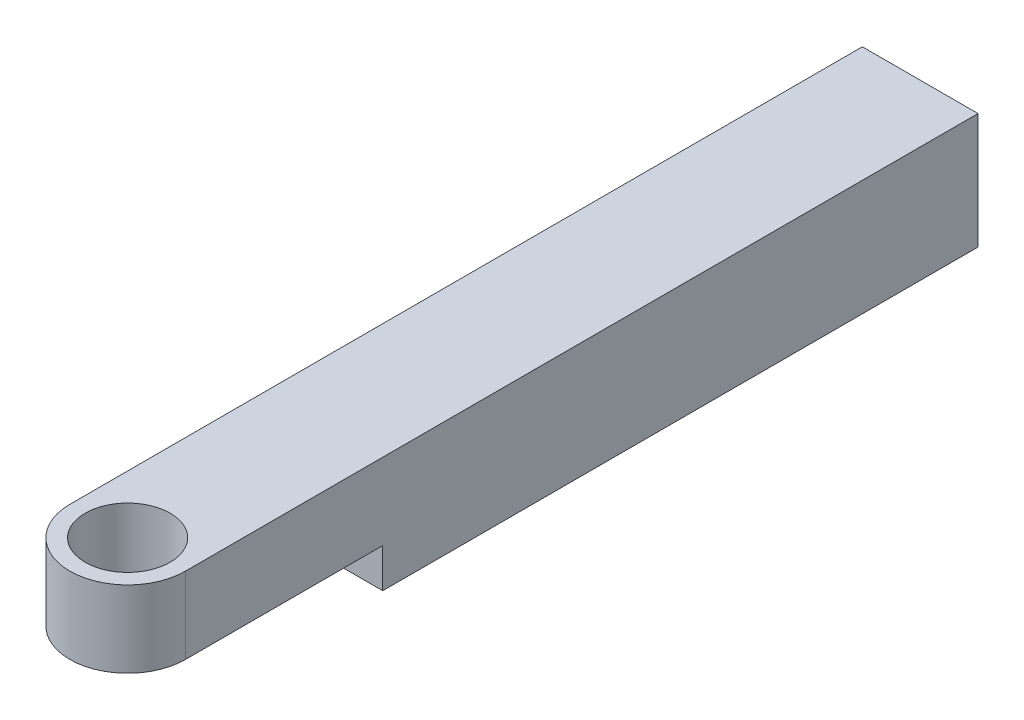
ISO-10303-21;
HEADER;
FILE_DESCRIPTION(('STEP AP214'),'2;1');
FILE_NAME('part.step','',(''),(''),'','','');
FILE_SCHEMA(('AUTOMOTIVE_DESIGN { 1 0 10303 214 1 1 1 1 }'));
ENDSEC;
DATA;
#1=APPLICATION_CONTEXT('core data for automotive mechanical design processes');
#2=APPLICATION_PROTOCOL_DEFINITION('international standard','automotive_design',2000,#1);
#3=PRODUCT_CONTEXT('',#1,'mechanical');
#4=PRODUCT('Part','Part','',(#3));
#5=PRODUCT_RELATED_PRODUCT_CATEGORY('part','',(#4));
#6=PRODUCT_DEFINITION_FORMATION('','',#4);
#7=PRODUCT_DEFINITION_CONTEXT('part definition',#1,'design');
#8=PRODUCT_DEFINITION('design','',#6,#7);
#9=PRODUCT_DEFINITION_SHAPE('','',#8);
#10=(LENGTH_UNIT() NAMED_UNIT(*) SI_UNIT(.MILLI.,.METRE.));
#11=(NAMED_UNIT(*) PLANE_ANGLE_UNIT() SI_UNIT($,.RADIAN.));
#12=(NAMED_UNIT(*) SI_UNIT($,.STERADIAN.) SOLID_ANGLE_UNIT());
#13=UNCERTAINTY_MEASURE_WITH_UNIT(LENGTH_MEASURE(1.E-05),#10,'distance_accuracy_value','');
#14=(GEOMETRIC_REPRESENTATION_CONTEXT(3) GLOBAL_UNCERTAINTY_ASSIGNED_CONTEXT((#13)) GLOBAL_UNIT_ASSIGNED_CONTEXT((#10,
#11,#12)) REPRESENTATION_CONTEXT('',''));
#15=CARTESIAN_POINT('',(0.,0.,0.));
#16=DIRECTION('',(0.,0.,1.));
#17=DIRECTION('',(1.,0.,0.));
#18=AXIS2_PLACEMENT_3D('',#15,#16,#17);
#19=CARTESIAN_POINT('',(-3.4,2.3,46.6));
#20=DIRECTION('',(0.,-1.,0.));
#21=DIRECTION('',(0.,0.,-1.));
#22=AXIS2_PLACEMENT_3D('',#19,#20,#21);
#23=CYLINDRICAL_SURFACE('',#22,3.4);
#24=DIRECTION('',(0.,1.,0.));
#25=VECTOR('',#24,1.);
#26=CARTESIAN_POINT('',(-6.8,2.3,46.6));
#27=LINE('',#26,#25);
#28=CARTESIAN_POINT('',(-6.8,2.3,46.6));
#29=VERTEX_POINT('',#28);
#30=CARTESIAN_POINT('',(-6.8,6.8,46.6));
#31=VERTEX_POINT('',#30);
#32=EDGE_CURVE('E245',#29,#31,#27,.T.);
#33=ORIENTED_EDGE('',*,*,#32,.F.);
#34=CARTESIAN_POINT('',(-3.4,2.3,46.6));
#35=DIRECTION('',(0.,1.,0.));
#36=DIRECTION('',(-1.,0.,0.));
#37=AXIS2_PLACEMENT_3D('',#34,#35,#36);
#38=CIRCLE('',#37,3.4);
#39=CARTESIAN_POINT('',(0.,2.3,46.6));
#40=VERTEX_POINT('',#39);
#41=EDGE_CURVE('E44',#40,#29,#38,.F.);
#42=ORIENTED_EDGE('',*,*,#41,.F.);
#43=DIRECTION('',(0.,1.,0.));
#44=VECTOR('',#43,1.);
#45=CARTESIAN_POINT('',(0.,2.3,46.6));
#46=LINE('',#45,#44);
#47=CARTESIAN_POINT('',(0.,6.8,46.6));
#48=VERTEX_POINT('',#47);
#49=EDGE_CURVE('E157',#48,#40,#46,.F.);
#50=ORIENTED_EDGE('',*,*,#49,.F.);
#51=CARTESIAN_POINT('',(-3.4,6.8,46.6));
#52=DIRECTION('',(0.,-1.,0.));
#53=DIRECTION('',(1.,0.,0.));
#54=AXIS2_PLACEMENT_3D('',#51,#52,#53);
#55=CIRCLE('',#54,3.4);
#56=EDGE_CURVE('E11',#31,#48,#55,.F.);
#57=ORIENTED_EDGE('',*,*,#56,.F.);
#58=EDGE_LOOP('',(#33,#42,#50,#57));
#59=FACE_BOUND('',#58,.T.);
#60=ADVANCED_FACE('F36',(#59),#23,.T.);
#61=CARTESIAN_POINT('',(0.,0.,50.));
#62=DIRECTION('',(0.,1.,0.));
#63=DIRECTION('',(-1.,0.,0.));
#64=AXIS2_PLACEMENT_3D('',#61,#62,#63);
#65=PLANE('',#64);
#66=DIRECTION('',(1.,0.,0.));
#67=VECTOR('',#66,1.);
#68=CARTESIAN_POINT('',(0.,0.,35.));
#69=LINE('',#68,#67);
#70=CARTESIAN_POINT('',(-6.8,0.,35.));
#71=VERTEX_POINT('',#70);
#72=CARTESIAN_POINT('',(0.,0.,35.));
#73=VERTEX_POINT('',#72);
#74=EDGE_CURVE('E150',#71,#73,#69,.T.);
#75=ORIENTED_EDGE('',*,*,#74,.F.);
#76=DIRECTION('',(0.,0.,-1.));
#77=VECTOR('',#76,1.);
#78=CARTESIAN_POINT('',(-6.8,0.,50.));
#79=LINE('',#78,#77);
#80=CARTESIAN_POINT('',(-6.8,0.,0.));
#81=VERTEX_POINT('',#80);
#82=EDGE_CURVE('E237',#71,#81,#79,.T.);
#83=ORIENTED_EDGE('',*,*,#82,.T.);
#84=DIRECTION('',(1.,0.,0.));
#85=VECTOR('',#84,1.);
#86=CARTESIAN_POINT('',(0.,0.,0.));
#87=LINE('',#86,#85);
#88=CARTESIAN_POINT('',(0.,0.,0.));
#89=VERTEX_POINT('',#88);
#90=EDGE_CURVE('E232',#81,#89,#87,.T.);
#91=ORIENTED_EDGE('',*,*,#90,.T.);
#92=DIRECTION('',(0.,0.,-1.));
#93=VECTOR('',#92,1.);
#94=CARTESIAN_POINT('',(0.,0.,50.));
#95=LINE('',#94,#93);
#96=EDGE_CURVE('E235',#73,#89,#95,.T.);
#97=ORIENTED_EDGE('',*,*,#96,.F.);
#98=EDGE_LOOP('',(#75,#83,#91,#97));
#99=FACE_BOUND('',#98,.T.);
#100=ADVANCED_FACE('F277',(#99),#65,.F.);
#101=CARTESIAN_POINT('',(-3.4,3.4,50.));
#102=DIRECTION('',(0.,0.,-1.));
#103=DIRECTION('',(-1.,0.,0.));
#104=AXIS2_PLACEMENT_3D('',#101,#102,#103);
#105=CYLINDRICAL_SURFACE('',#104,1.75);
#106=DIRECTION('',(0.,0.,-1.));
#107=VECTOR('',#106,1.);
#108=CARTESIAN_POINT('',(-2.03893424111838,2.3,50.));
#109=LINE('',#108,#107);
#110=CARTESIAN_POINT('',(-2.03893424111838,2.3,43.));
#111=VERTEX_POINT('',#110);
#112=CARTESIAN_POINT('',(-2.03893424111838,2.3,35.));
#113=VERTEX_POINT('',#112);
#114=EDGE_CURVE('E140',#111,#113,#109,.T.);
#115=ORIENTED_EDGE('',*,*,#114,.F.);
#116=CARTESIAN_POINT('',(-3.4,3.4,43.));
#117=DIRECTION('',(0.,0.,-1.));
#118=DIRECTION('',(-1.,0.,0.));
#119=AXIS2_PLACEMENT_3D('',#116,#117,#118);
#120=CIRCLE('',#119,1.75);
#121=CARTESIAN_POINT('',(-4.76106575888162,2.3,43.));
#122=VERTEX_POINT('',#121);
#123=EDGE_CURVE('E170',#122,#111,#120,.T.);
#124=ORIENTED_EDGE('',*,*,#123,.F.);
#125=DIRECTION('',(0.,0.,-1.));
#126=VECTOR('',#125,1.);
#127=CARTESIAN_POINT('',(-4.76106575888162,2.3,50.));
#128=LINE('',#127,#126);
#129=CARTESIAN_POINT('',(-4.76106575888162,2.3,35.));
#130=VERTEX_POINT('',#129);
#131=EDGE_CURVE('E161',#130,#122,#128,.F.);
#132=ORIENTED_EDGE('',*,*,#131,.F.);
#133=CARTESIAN_POINT('',(-3.4,3.4,35.));
#134=DIRECTION('',(0.,0.,1.));
#135=DIRECTION('',(1.,0.,0.));
#136=AXIS2_PLACEMENT_3D('',#133,#134,#135);
#137=CIRCLE('',#136,1.75);
#138=EDGE_CURVE('E167',#130,#113,#137,.T.);
#139=ORIENTED_EDGE('',*,*,#138,.T.);
#140=EDGE_LOOP('',(#115,#124,#132,#139));
#141=FACE_BOUND('',#140,.T.);
#142=CARTESIAN_POINT('',(-3.4,3.4,20.));
#143=DIRECTION('',(0.,0.,-1.));
#144=DIRECTION('',(-1.,0.,0.));
#145=AXIS2_PLACEMENT_3D('',#142,#143,#144);
#146=CIRCLE('',#145,1.75);
#147=CARTESIAN_POINT('',(-5.15,3.4,20.));
#148=VERTEX_POINT('',#147);
#149=EDGE_CURVE('E212',#148,#148,#146,.T.);
#150=ORIENTED_EDGE('',*,*,#149,.T.);
#151=EDGE_LOOP('',(#150));
#152=FACE_BOUND('',#151,.T.);
#153=ADVANCED_FACE('F281',(#141,#152),#105,.F.);
#154=CARTESIAN_POINT('',(0.,0.,0.));
#155=DIRECTION('',(0.,0.,1.));
#156=DIRECTION('',(1.,0.,0.));
#157=AXIS2_PLACEMENT_3D('',#154,#155,#156);
#158=PLANE('',#157);
#159=DIRECTION('',(0.5,0.866025403784438,0.));
#160=VECTOR('',#159,1.);
#161=CARTESIAN_POINT('',(-6.57542648054294,3.4,0.));
#162=LINE('',#161,#160);
#163=CARTESIAN_POINT('',(-6.57542648054294,3.4,0.));
#164=VERTEX_POINT('',#163);
#165=CARTESIAN_POINT('',(-4.98771324027147,6.15,0.));
#166=VERTEX_POINT('',#165);
#167=EDGE_CURVE('E196',#164,#166,#162,.T.);
#168=ORIENTED_EDGE('',*,*,#167,.F.);
#169=DIRECTION('',(-0.5,0.866025403784439,0.));
#170=VECTOR('',#169,1.);
#171=CARTESIAN_POINT('',(-4.98771324027147,0.649999999999999,0.));
#172=LINE('',#171,#170);
#173=CARTESIAN_POINT('',(-4.98771324027147,0.649999999999999,0.));
#174=VERTEX_POINT('',#173);
#175=EDGE_CURVE('E169',#174,#164,#172,.T.);
#176=ORIENTED_EDGE('',*,*,#175,.F.);
#177=DIRECTION('',(-1.,0.,0.));
#178=VECTOR('',#177,1.);
#179=CARTESIAN_POINT('',(-1.81228675972853,0.65,0.));
#180=LINE('',#179,#178);
#181=CARTESIAN_POINT('',(-1.81228675972853,0.65,0.));
#182=VERTEX_POINT('',#181);
#183=EDGE_CURVE('E179',#182,#174,#180,.T.);
#184=ORIENTED_EDGE('',*,*,#183,.F.);
#185=DIRECTION('',(-0.5,-0.866025403784438,0.));
#186=VECTOR('',#185,1.);
#187=CARTESIAN_POINT('',(-0.224573519457058,3.4,0.));
#188=LINE('',#187,#186);
#189=CARTESIAN_POINT('',(-0.224573519457058,3.4,0.));
#190=VERTEX_POINT('',#189);
#191=EDGE_CURVE('E205',#190,#182,#188,.T.);
#192=ORIENTED_EDGE('',*,*,#191,.F.);
#193=DIRECTION('',(0.5,-0.866025403784439,0.));
#194=VECTOR('',#193,1.);
#195=CARTESIAN_POINT('',(-1.81228675972853,6.15,0.));
#196=LINE('',#195,#194);
#197=CARTESIAN_POINT('',(-1.81228675972853,6.15,0.));
#198=VERTEX_POINT('',#197);
#199=EDGE_CURVE('E202',#198,#190,#196,.T.);
#200=ORIENTED_EDGE('',*,*,#199,.F.);
#201=DIRECTION('',(1.,0.,0.));
#202=VECTOR('',#201,1.);
#203=CARTESIAN_POINT('',(-4.98771324027147,6.15,0.));
#204=LINE('',#203,#202);
#205=EDGE_CURVE('E199',#166,#198,#204,.T.);
#206=ORIENTED_EDGE('',*,*,#205,.F.);
#207=EDGE_LOOP('',(#168,#176,#184,#192,#200,#206));
#208=FACE_BOUND('',#207,.T.);
#209=DIRECTION('',(0.,1.,0.));
#210=VECTOR('',#209,1.);
#211=CARTESIAN_POINT('',(0.,0.,0.));
#212=LINE('',#211,#210);
#213=CARTESIAN_POINT('',(0.,6.8,0.));
#214=VERTEX_POINT('',#213);
#215=EDGE_CURVE('E223',#89,#214,#212,.T.);
#216=ORIENTED_EDGE('',*,*,#215,.F.);
#217=ORIENTED_EDGE('',*,*,#90,.F.);
#218=DIRECTION('',(0.,-1.,0.));
#219=VECTOR('',#218,1.);
#220=CARTESIAN_POINT('',(-6.8,0.,0.));
#221=LINE('',#220,#219);
#222=CARTESIAN_POINT('',(-6.8,6.8,0.));
#223=VERTEX_POINT('',#222);
#224=EDGE_CURVE('E229',#223,#81,#221,.T.);
#225=ORIENTED_EDGE('',*,*,#224,.F.);
#226=DIRECTION('',(-1.,0.,0.));
#227=VECTOR('',#226,1.);
#228=CARTESIAN_POINT('',(0.,6.8,0.));
#229=LINE('',#228,#227);
#230=EDGE_CURVE('E226',#214,#223,#229,.T.);
#231=ORIENTED_EDGE('',*,*,#230,.F.);
#232=EDGE_LOOP('',(#216,#217,#225,#231));
#233=FACE_BOUND('',#232,.T.);
#234=ADVANCED_FACE('F287',(#208,#233),#158,.F.);
#235=CARTESIAN_POINT('',(0.,0.,50.));
#236=DIRECTION('',(-1.,0.,0.));
#237=DIRECTION('',(0.,-1.,0.));
#238=AXIS2_PLACEMENT_3D('',#235,#236,#237);
#239=PLANE('',#238);
#240=DIRECTION('',(0.,0.,-1.));
#241=VECTOR('',#240,1.);
#242=CARTESIAN_POINT('',(0.,6.8,50.));
#243=LINE('',#242,#241);
#244=EDGE_CURVE('E174',#48,#214,#243,.T.);
#245=ORIENTED_EDGE('',*,*,#244,.F.);
#246=ORIENTED_EDGE('',*,*,#49,.T.);
#247=DIRECTION('',(0.,0.,1.));
#248=VECTOR('',#247,1.);
#249=CARTESIAN_POINT('',(0.,2.3,35.));
#250=LINE('',#249,#248);
#251=CARTESIAN_POINT('',(0.,2.3,35.));
#252=VERTEX_POINT('',#251);
#253=EDGE_CURVE('E138',#252,#40,#250,.T.);
#254=ORIENTED_EDGE('',*,*,#253,.F.);
#255=DIRECTION('',(0.,1.,0.));
#256=VECTOR('',#255,1.);
#257=CARTESIAN_POINT('',(0.,0.,35.));
#258=LINE('',#257,#256);
#259=EDGE_CURVE('E147',#73,#252,#258,.T.);
#260=ORIENTED_EDGE('',*,*,#259,.F.);
#261=ORIENTED_EDGE('',*,*,#96,.T.);
#262=ORIENTED_EDGE('',*,*,#215,.T.);
#263=EDGE_LOOP('',(#245,#246,#254,#260,#261,#262));
#264=FACE_BOUND('',#263,.T.);
#265=ADVANCED_FACE('F156',(#264),#239,.F.);
#266=CARTESIAN_POINT('',(0.,6.8,50.));
#267=DIRECTION('',(0.,-1.,0.));
#268=DIRECTION('',(1.,0.,0.));
#269=AXIS2_PLACEMENT_3D('',#266,#267,#268);
#270=PLANE('',#269);
#271=CARTESIAN_POINT('',(-3.4,6.8,46.6));
#272=DIRECTION('',(0.,-1.,0.));
#273=DIRECTION('',(1.,0.,0.));
#274=AXIS2_PLACEMENT_3D('',#271,#272,#273);
#275=CIRCLE('',#274,2.5);
#276=CARTESIAN_POINT('',(-0.899999999999998,6.8,46.6));
#277=VERTEX_POINT('',#276);
#278=EDGE_CURVE('E153',#277,#277,#275,.T.);
#279=ORIENTED_EDGE('',*,*,#278,.T.);
#280=EDGE_LOOP('',(#279));
#281=FACE_BOUND('',#280,.T.);
#282=DIRECTION('',(0.,0.,-1.));
#283=VECTOR('',#282,1.);
#284=CARTESIAN_POINT('',(-6.8,6.8,50.));
#285=LINE('',#284,#283);
#286=EDGE_CURVE('E239',#31,#223,#285,.T.);
#287=ORIENTED_EDGE('',*,*,#286,.F.);
#288=ORIENTED_EDGE('',*,*,#56,.T.);
#289=ORIENTED_EDGE('',*,*,#244,.T.);
#290=ORIENTED_EDGE('',*,*,#230,.T.);
#291=EDGE_LOOP('',(#287,#288,#289,#290));
#292=FACE_BOUND('',#291,.T.);
#293=ADVANCED_FACE('F295',(#281,#292),#270,.F.);
#294=CARTESIAN_POINT('',(-6.8,0.,50.));
#295=DIRECTION('',(1.,0.,0.));
#296=DIRECTION('',(0.,0.,-1.));
#297=AXIS2_PLACEMENT_3D('',#294,#295,#296);
#298=PLANE('',#297);
#299=DIRECTION('',(0.,0.,1.));
#300=VECTOR('',#299,1.);
#301=CARTESIAN_POINT('',(-6.8,2.3,35.));
#302=LINE('',#301,#300);
#303=CARTESIAN_POINT('',(-6.8,2.3,35.));
#304=VERTEX_POINT('',#303);
#305=EDGE_CURVE('E158',#304,#29,#302,.T.);
#306=ORIENTED_EDGE('',*,*,#305,.T.);
#307=ORIENTED_EDGE('',*,*,#32,.T.);
#308=ORIENTED_EDGE('',*,*,#286,.T.);
#309=ORIENTED_EDGE('',*,*,#224,.T.);
#310=ORIENTED_EDGE('',*,*,#82,.F.);
#311=DIRECTION('',(0.,-1.,0.));
#312=VECTOR('',#311,1.);
#313=CARTESIAN_POINT('',(-6.8,0.,35.));
#314=LINE('',#313,#312);
#315=EDGE_CURVE('E143',#304,#71,#314,.T.);
#316=ORIENTED_EDGE('',*,*,#315,.F.);
#317=EDGE_LOOP('',(#306,#307,#308,#309,#310,#316));
#318=FACE_BOUND('',#317,.T.);
#319=ADVANCED_FACE('F252',(#318),#298,.F.);
#320=CARTESIAN_POINT('',(-4.98771324027147,0.649999999999999,20.));
#321=DIRECTION('',(-0.866025403784439,-0.5,0.));
#322=DIRECTION('',(0.5,-0.866025403784439,0.));
#323=AXIS2_PLACEMENT_3D('',#320,#321,#322);
#324=PLANE('',#323);
#325=ORIENTED_EDGE('',*,*,#175,.T.);
#326=DIRECTION('',(0.,0.,-1.));
#327=VECTOR('',#326,1.);
#328=CARTESIAN_POINT('',(-6.57542648054294,3.4,20.));
#329=LINE('',#328,#327);
#330=CARTESIAN_POINT('',(-6.57542648054294,3.4,20.));
#331=VERTEX_POINT('',#330);
#332=EDGE_CURVE('E194',#331,#164,#329,.T.);
#333=ORIENTED_EDGE('',*,*,#332,.F.);
#334=DIRECTION('',(-0.5,0.866025403784439,0.));
#335=VECTOR('',#334,1.);
#336=CARTESIAN_POINT('',(-4.98771324027147,0.649999999999999,20.));
#337=LINE('',#336,#335);
#338=CARTESIAN_POINT('',(-4.98771324027147,0.649999999999999,20.));
#339=VERTEX_POINT('',#338);
#340=EDGE_CURVE('E175',#339,#331,#337,.T.);
#341=ORIENTED_EDGE('',*,*,#340,.F.);
#342=DIRECTION('',(0.,0.,-1.));
#343=VECTOR('',#342,1.);
#344=CARTESIAN_POINT('',(-4.98771324027147,0.649999999999999,20.));
#345=LINE('',#344,#343);
#346=EDGE_CURVE('E210',#339,#174,#345,.T.);
#347=ORIENTED_EDGE('',*,*,#346,.T.);
#348=EDGE_LOOP('',(#325,#333,#341,#347));
#349=FACE_BOUND('',#348,.T.);
#350=ADVANCED_FACE('F294',(#349),#324,.F.);
#351=CARTESIAN_POINT('',(-1.81228675972853,0.65,20.));
#352=DIRECTION('',(0.,-1.,0.));
#353=DIRECTION('',(1.,0.,0.));
#354=AXIS2_PLACEMENT_3D('',#351,#352,#353);
#355=PLANE('',#354);
#356=ORIENTED_EDGE('',*,*,#183,.T.);
#357=ORIENTED_EDGE('',*,*,#346,.F.);
#358=DIRECTION('',(-1.,0.,0.));
#359=VECTOR('',#358,1.);
#360=CARTESIAN_POINT('',(-1.81228675972853,0.65,20.));
#361=LINE('',#360,#359);
#362=CARTESIAN_POINT('',(-1.81228675972853,0.65,20.));
#363=VERTEX_POINT('',#362);
#364=EDGE_CURVE('E191',#363,#339,#361,.T.);
#365=ORIENTED_EDGE('',*,*,#364,.F.);
#366=DIRECTION('',(0.,0.,-1.));
#367=VECTOR('',#366,1.);
#368=CARTESIAN_POINT('',(-1.81228675972853,0.65,20.));
#369=LINE('',#368,#367);
#370=EDGE_CURVE('E213',#363,#182,#369,.T.);
#371=ORIENTED_EDGE('',*,*,#370,.T.);
#372=EDGE_LOOP('',(#356,#357,#365,#371));
#373=FACE_BOUND('',#372,.T.);
#374=ADVANCED_FACE('F323',(#373),#355,.F.);
#375=CARTESIAN_POINT('',(-0.224573519457058,3.4,20.));
#376=DIRECTION('',(0.866025403784439,-0.5,0.));
#377=DIRECTION('',(0.5,0.866025403784439,0.));
#378=AXIS2_PLACEMENT_3D('',#375,#376,#377);
#379=PLANE('',#378);
#380=ORIENTED_EDGE('',*,*,#191,.T.);
#381=ORIENTED_EDGE('',*,*,#370,.F.);
#382=DIRECTION('',(-0.5,-0.866025403784438,0.));
#383=VECTOR('',#382,1.);
#384=CARTESIAN_POINT('',(-0.224573519457058,3.4,20.));
#385=LINE('',#384,#383);
#386=CARTESIAN_POINT('',(-0.224573519457058,3.4,20.));
#387=VERTEX_POINT('',#386);
#388=EDGE_CURVE('E188',#387,#363,#385,.T.);
#389=ORIENTED_EDGE('',*,*,#388,.F.);
#390=DIRECTION('',(0.,0.,-1.));
#391=VECTOR('',#390,1.);
#392=CARTESIAN_POINT('',(-0.224573519457058,3.4,20.));
#393=LINE('',#392,#391);
#394=EDGE_CURVE('E215',#387,#190,#393,.T.);
#395=ORIENTED_EDGE('',*,*,#394,.T.);
#396=EDGE_LOOP('',(#380,#381,#389,#395));
#397=FACE_BOUND('',#396,.T.);
#398=ADVANCED_FACE('F326',(#397),#379,.F.);
#399=CARTESIAN_POINT('',(-1.81228675972853,6.15,20.));
#400=DIRECTION('',(0.866025403784439,0.5,0.));
#401=DIRECTION('',(-0.5,0.866025403784439,0.));
#402=AXIS2_PLACEMENT_3D('',#399,#400,#401);
#403=PLANE('',#402);
#404=ORIENTED_EDGE('',*,*,#199,.T.);
#405=ORIENTED_EDGE('',*,*,#394,.F.);
#406=DIRECTION('',(0.5,-0.866025403784439,0.));
#407=VECTOR('',#406,1.);
#408=CARTESIAN_POINT('',(-1.81228675972853,6.15,20.));
#409=LINE('',#408,#407);
#410=CARTESIAN_POINT('',(-1.81228675972853,6.15,20.));
#411=VERTEX_POINT('',#410);
#412=EDGE_CURVE('E185',#411,#387,#409,.T.);
#413=ORIENTED_EDGE('',*,*,#412,.F.);
#414=DIRECTION('',(0.,0.,-1.));
#415=VECTOR('',#414,1.);
#416=CARTESIAN_POINT('',(-1.81228675972853,6.15,20.));
#417=LINE('',#416,#415);
#418=EDGE_CURVE('E217',#411,#198,#417,.T.);
#419=ORIENTED_EDGE('',*,*,#418,.T.);
#420=EDGE_LOOP('',(#404,#405,#413,#419));
#421=FACE_BOUND('',#420,.T.);
#422=ADVANCED_FACE('F330',(#421),#403,.F.);
#423=CARTESIAN_POINT('',(-4.98771324027147,6.15,20.));
#424=DIRECTION('',(0.,1.,0.));
#425=DIRECTION('',(0.,0.,1.));
#426=AXIS2_PLACEMENT_3D('',#423,#424,#425);
#427=PLANE('',#426);
#428=ORIENTED_EDGE('',*,*,#205,.T.);
#429=ORIENTED_EDGE('',*,*,#418,.F.);
#430=DIRECTION('',(1.,0.,0.));
#431=VECTOR('',#430,1.);
#432=CARTESIAN_POINT('',(-4.98771324027147,6.15,20.));
#433=LINE('',#432,#431);
#434=CARTESIAN_POINT('',(-4.98771324027147,6.15,20.));
#435=VERTEX_POINT('',#434);
#436=EDGE_CURVE('E182',#435,#411,#433,.T.);
#437=ORIENTED_EDGE('',*,*,#436,.F.);
#438=DIRECTION('',(0.,0.,-1.));
#439=VECTOR('',#438,1.);
#440=CARTESIAN_POINT('',(-4.98771324027147,6.15,20.));
#441=LINE('',#440,#439);
#442=EDGE_CURVE('E219',#435,#166,#441,.T.);
#443=ORIENTED_EDGE('',*,*,#442,.T.);
#444=EDGE_LOOP('',(#428,#429,#437,#443));
#445=FACE_BOUND('',#444,.T.);
#446=ADVANCED_FACE('F332',(#445),#427,.F.);
#447=CARTESIAN_POINT('',(-6.57542648054294,3.4,20.));
#448=DIRECTION('',(-0.866025403784439,0.5,0.));
#449=DIRECTION('',(-0.5,-0.866025403784439,0.));
#450=AXIS2_PLACEMENT_3D('',#447,#448,#449);
#451=PLANE('',#450);
#452=ORIENTED_EDGE('',*,*,#167,.T.);
#453=ORIENTED_EDGE('',*,*,#442,.F.);
#454=DIRECTION('',(0.5,0.866025403784438,0.));
#455=VECTOR('',#454,1.);
#456=CARTESIAN_POINT('',(-6.57542648054294,3.4,20.));
#457=LINE('',#456,#455);
#458=EDGE_CURVE('E178',#331,#435,#457,.T.);
#459=ORIENTED_EDGE('',*,*,#458,.F.);
#460=ORIENTED_EDGE('',*,*,#332,.T.);
#461=EDGE_LOOP('',(#452,#453,#459,#460));
#462=FACE_BOUND('',#461,.T.);
#463=ADVANCED_FACE('F316',(#462),#451,.F.);
#464=CARTESIAN_POINT('',(0.,0.,20.));
#465=DIRECTION('',(0.,0.,-1.));
#466=DIRECTION('',(-1.,0.,0.));
#467=AXIS2_PLACEMENT_3D('',#464,#465,#466);
#468=PLANE('',#467);
#469=ORIENTED_EDGE('',*,*,#149,.F.);
#470=EDGE_LOOP('',(#469));
#471=FACE_BOUND('',#470,.T.);
#472=ORIENTED_EDGE('',*,*,#340,.T.);
#473=ORIENTED_EDGE('',*,*,#458,.T.);
#474=ORIENTED_EDGE('',*,*,#436,.T.);
#475=ORIENTED_EDGE('',*,*,#412,.T.);
#476=ORIENTED_EDGE('',*,*,#388,.T.);
#477=ORIENTED_EDGE('',*,*,#364,.T.);
#478=EDGE_LOOP('',(#472,#473,#474,#475,#476,#477));
#479=FACE_BOUND('',#478,.T.);
#480=ADVANCED_FACE('F273',(#471,#479),#468,.T.);
#481=CARTESIAN_POINT('',(0.,0.,43.));
#482=DIRECTION('',(0.,0.,-1.));
#483=DIRECTION('',(-1.,0.,0.));
#484=AXIS2_PLACEMENT_3D('',#481,#482,#483);
#485=PLANE('',#484);
#486=DIRECTION('',(1.,0.,0.));
#487=VECTOR('',#486,1.);
#488=CARTESIAN_POINT('',(0.,2.3,43.));
#489=LINE('',#488,#487);
#490=EDGE_CURVE('E173',#122,#111,#489,.T.);
#491=ORIENTED_EDGE('',*,*,#490,.F.);
#492=ORIENTED_EDGE('',*,*,#123,.T.);
#493=EDGE_LOOP('',(#491,#492));
#494=FACE_BOUND('',#493,.T.);
#495=ADVANCED_FACE('F266',(#494),#485,.T.);
#496=CARTESIAN_POINT('',(0.,2.3,35.));
#497=DIRECTION('',(0.,1.,0.));
#498=DIRECTION('',(-1.,0.,0.));
#499=AXIS2_PLACEMENT_3D('',#496,#497,#498);
#500=PLANE('',#499);
#501=CARTESIAN_POINT('',(-3.4,2.3,46.6));
#502=DIRECTION('',(0.,-1.,0.));
#503=DIRECTION('',(1.,0.,0.));
#504=AXIS2_PLACEMENT_3D('',#501,#502,#503);
#505=CIRCLE('',#504,2.5);
#506=CARTESIAN_POINT('',(-0.899999999999997,2.3,46.6));
#507=VERTEX_POINT('',#506);
#508=EDGE_CURVE('E258',#507,#507,#505,.T.);
#509=ORIENTED_EDGE('',*,*,#508,.F.);
#510=EDGE_LOOP('',(#509));
#511=FACE_BOUND('',#510,.T.);
#512=ORIENTED_EDGE('',*,*,#253,.T.);
#513=ORIENTED_EDGE('',*,*,#41,.T.);
#514=ORIENTED_EDGE('',*,*,#305,.F.);
#515=DIRECTION('',(-1.,0.,0.));
#516=VECTOR('',#515,1.);
#517=CARTESIAN_POINT('',(0.,2.3,35.));
#518=LINE('',#517,#516);
#519=EDGE_CURVE('E144',#130,#304,#518,.T.);
#520=ORIENTED_EDGE('',*,*,#519,.F.);
#521=ORIENTED_EDGE('',*,*,#131,.T.);
#522=ORIENTED_EDGE('',*,*,#490,.T.);
#523=ORIENTED_EDGE('',*,*,#114,.T.);
#524=EDGE_CURVE('E134',#252,#113,#518,.T.);
#525=ORIENTED_EDGE('',*,*,#524,.F.);
#526=EDGE_LOOP('',(#512,#513,#514,#520,#521,#522,#523,#525));
#527=FACE_BOUND('',#526,.T.);
#528=ADVANCED_FACE('F136',(#511,#527),#500,.F.);
#529=CARTESIAN_POINT('',(0.,0.,35.));
#530=DIRECTION('',(0.,0.,1.));
#531=DIRECTION('',(1.,0.,0.));
#532=AXIS2_PLACEMENT_3D('',#529,#530,#531);
#533=PLANE('',#532);
#534=ORIENTED_EDGE('',*,*,#519,.T.);
#535=ORIENTED_EDGE('',*,*,#315,.T.);
#536=ORIENTED_EDGE('',*,*,#74,.T.);
#537=ORIENTED_EDGE('',*,*,#259,.T.);
#538=ORIENTED_EDGE('',*,*,#524,.T.);
#539=ORIENTED_EDGE('',*,*,#138,.F.);
#540=EDGE_LOOP('',(#534,#535,#536,#537,#538,#539));
#541=FACE_BOUND('',#540,.T.);
#542=ADVANCED_FACE('F148',(#541),#533,.T.);
#543=CARTESIAN_POINT('',(-3.4,22.3,46.6));
#544=DIRECTION('',(0.,-1.,0.));
#545=DIRECTION('',(1.,0.,0.));
#546=AXIS2_PLACEMENT_3D('',#543,#544,#545);
#547=CYLINDRICAL_SURFACE('',#546,2.5);
#548=ORIENTED_EDGE('',*,*,#508,.T.);
#549=EDGE_LOOP('',(#548));
#550=FACE_BOUND('',#549,.T.);
#551=ORIENTED_EDGE('',*,*,#278,.F.);
#552=EDGE_LOOP('',(#551));
#553=FACE_BOUND('',#552,.T.);
#554=ADVANCED_FACE('F262',(#550,#553),#547,.F.);
#555=CLOSED_SHELL('',(#60,#100,#153,#234,#265,#293,#319,#350,#374,#398,#422,#446,#463,#480,#495,
#528,#542,#554));
#556=MANIFOLD_SOLID_BREP('B2',#555);
#557=ADVANCED_BREP_SHAPE_REPRESENTATION('',(#18,#556),#14);
#558=SHAPE_DEFINITION_REPRESENTATION(#9,#557);
ENDSEC;
END-ISO-10303-21;
